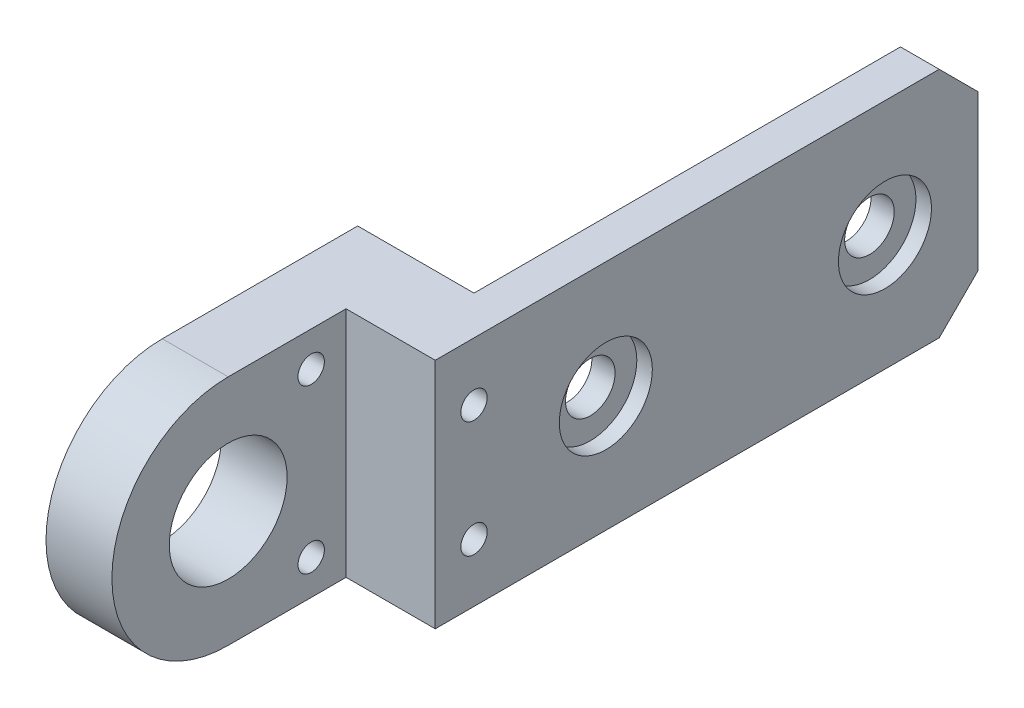
ISO-10303-21;
HEADER;
FILE_DESCRIPTION(('STEP AP214'),'2;1');
FILE_NAME('part.step','',(''),(''),'','','');
FILE_SCHEMA(('AUTOMOTIVE_DESIGN { 1 0 10303 214 1 1 1 1 }'));
ENDSEC;
DATA;
#1=APPLICATION_CONTEXT('core data for automotive mechanical design processes');
#2=APPLICATION_PROTOCOL_DEFINITION('international standard','automotive_design',2000,#1);
#3=PRODUCT_CONTEXT('',#1,'mechanical');
#4=PRODUCT('Part','Part','',(#3));
#5=PRODUCT_RELATED_PRODUCT_CATEGORY('part','',(#4));
#6=PRODUCT_DEFINITION_FORMATION('','',#4);
#7=PRODUCT_DEFINITION_CONTEXT('part definition',#1,'design');
#8=PRODUCT_DEFINITION('design','',#6,#7);
#9=PRODUCT_DEFINITION_SHAPE('','',#8);
#10=(LENGTH_UNIT() NAMED_UNIT(*) SI_UNIT(.MILLI.,.METRE.));
#11=(NAMED_UNIT(*) PLANE_ANGLE_UNIT() SI_UNIT($,.RADIAN.));
#12=(NAMED_UNIT(*) SI_UNIT($,.STERADIAN.) SOLID_ANGLE_UNIT());
#13=UNCERTAINTY_MEASURE_WITH_UNIT(LENGTH_MEASURE(1.E-05),#10,'distance_accuracy_value','');
#14=(GEOMETRIC_REPRESENTATION_CONTEXT(3) GLOBAL_UNCERTAINTY_ASSIGNED_CONTEXT((#13)) GLOBAL_UNIT_ASSIGNED_CONTEXT((#10,
#11,#12)) REPRESENTATION_CONTEXT('',''));
#15=CARTESIAN_POINT('',(0.,0.,0.));
#16=DIRECTION('',(0.,0.,1.));
#17=DIRECTION('',(1.,0.,0.));
#18=AXIS2_PLACEMENT_3D('',#15,#16,#17);
#19=CARTESIAN_POINT('',(18.,0.,0.));
#20=DIRECTION('',(1.,0.,0.));
#21=DIRECTION('',(0.,0.,-1.));
#22=AXIS2_PLACEMENT_3D('',#19,#20,#21);
#23=PLANE('',#22);
#24=CARTESIAN_POINT('',(18.,0.,-37.2));
#25=DIRECTION('',(1.,0.,0.));
#26=DIRECTION('',(0.,0.,-1.));
#27=AXIS2_PLACEMENT_3D('',#24,#25,#26);
#28=CIRCLE('',#27,3.2);
#29=CARTESIAN_POINT('',(18.,0.,-40.4));
#30=VERTEX_POINT('',#29);
#31=EDGE_CURVE('E665',#30,#30,#28,.T.);
#32=ORIENTED_EDGE('',*,*,#31,.F.);
#33=EDGE_LOOP('',(#32));
#34=FACE_BOUND('',#33,.T.);
#35=CARTESIAN_POINT('',(18.,0.,-37.2));
#36=DIRECTION('',(1.,0.,0.));
#37=DIRECTION('',(0.,0.,-1.));
#38=AXIS2_PLACEMENT_3D('',#35,#36,#37);
#39=CIRCLE('',#38,6.);
#40=CARTESIAN_POINT('',(18.,0.,-43.2));
#41=VERTEX_POINT('',#40);
#42=EDGE_CURVE('E740',#41,#41,#39,.T.);
#43=ORIENTED_EDGE('',*,*,#42,.T.);
#44=EDGE_LOOP('',(#43));
#45=FACE_BOUND('',#44,.T.);
#46=ADVANCED_FACE('F209',(#34,#45),#23,.T.);
#47=CARTESIAN_POINT('',(18.,0.,-73.2));
#48=DIRECTION('',(1.,0.,0.));
#49=DIRECTION('',(0.,0.,-1.));
#50=AXIS2_PLACEMENT_3D('',#47,#48,#49);
#51=CIRCLE('',#50,3.19999999999999);
#52=CARTESIAN_POINT('',(18.,0.,-76.4));
#53=VERTEX_POINT('',#52);
#54=EDGE_CURVE('E670',#53,#53,#51,.T.);
#55=ORIENTED_EDGE('',*,*,#54,.F.);
#56=EDGE_LOOP('',(#55));
#57=FACE_BOUND('',#56,.T.);
#58=CARTESIAN_POINT('',(18.,0.,-73.2));
#59=DIRECTION('',(1.,0.,0.));
#60=DIRECTION('',(0.,0.,-1.));
#61=AXIS2_PLACEMENT_3D('',#58,#59,#60);
#62=CIRCLE('',#61,6.00000000000001);
#63=CARTESIAN_POINT('',(18.,0.,-79.2));
#64=VERTEX_POINT('',#63);
#65=EDGE_CURVE('E761',#64,#64,#62,.T.);
#66=ORIENTED_EDGE('',*,*,#65,.T.);
#67=EDGE_LOOP('',(#66));
#68=FACE_BOUND('',#67,.T.);
#69=ADVANCED_FACE('F357',(#57,#68),#23,.T.);
#70=CARTESIAN_POINT('',(8.5,15.,0.));
#71=DIRECTION('',(0.,-1.,0.));
#72=DIRECTION('',(0.,0.,-1.));
#73=AXIS2_PLACEMENT_3D('',#70,#71,#72);
#74=PLANE('',#73);
#75=DIRECTION('',(0.,0.,1.));
#76=VECTOR('',#75,1.);
#77=CARTESIAN_POINT('',(8.5,15.,0.));
#78=LINE('',#77,#76);
#79=CARTESIAN_POINT('',(8.5,15.,-15.2));
#80=VERTEX_POINT('',#79);
#81=CARTESIAN_POINT('',(8.5,15.,0.));
#82=VERTEX_POINT('',#81);
#83=EDGE_CURVE('E305',#80,#82,#78,.T.);
#84=ORIENTED_EDGE('',*,*,#83,.F.);
#85=DIRECTION('',(-1.,0.,0.));
#86=VECTOR('',#85,1.);
#87=CARTESIAN_POINT('',(15.,15.,-15.2));
#88=LINE('',#87,#86);
#89=CARTESIAN_POINT('',(20.,15.,-15.2));
#90=VERTEX_POINT('',#89);
#91=EDGE_CURVE('E309',#90,#80,#88,.T.);
#92=ORIENTED_EDGE('',*,*,#91,.F.);
#93=DIRECTION('',(0.,0.,-1.));
#94=VECTOR('',#93,1.);
#95=CARTESIAN_POINT('',(20.,15.,0.));
#96=LINE('',#95,#94);
#97=CARTESIAN_POINT('',(20.,15.,-80.2));
#98=VERTEX_POINT('',#97);
#99=EDGE_CURVE('E703',#90,#98,#96,.T.);
#100=ORIENTED_EDGE('',*,*,#99,.T.);
#101=DIRECTION('',(-1.,0.,0.));
#102=VECTOR('',#101,1.);
#103=CARTESIAN_POINT('',(18.,15.,-80.2));
#104=LINE('',#103,#102);
#105=CARTESIAN_POINT('',(15.,15.,-80.2));
#106=VERTEX_POINT('',#105);
#107=EDGE_CURVE('E691',#98,#106,#104,.T.);
#108=ORIENTED_EDGE('',*,*,#107,.T.);
#109=DIRECTION('',(0.,0.,-1.));
#110=VECTOR('',#109,1.);
#111=CARTESIAN_POINT('',(15.,15.,0.));
#112=LINE('',#111,#110);
#113=CARTESIAN_POINT('',(15.,15.,-25.2));
#114=VERTEX_POINT('',#113);
#115=EDGE_CURVE('E274',#114,#106,#112,.T.);
#116=ORIENTED_EDGE('',*,*,#115,.F.);
#117=DIRECTION('',(-1.,0.,0.));
#118=VECTOR('',#117,1.);
#119=CARTESIAN_POINT('',(8.5,15.,-25.2));
#120=LINE('',#119,#118);
#121=CARTESIAN_POINT('',(0.,15.,-25.2));
#122=VERTEX_POINT('',#121);
#123=EDGE_CURVE('E255',#114,#122,#120,.T.);
#124=ORIENTED_EDGE('',*,*,#123,.T.);
#125=DIRECTION('',(0.,0.,1.));
#126=VECTOR('',#125,1.);
#127=CARTESIAN_POINT('',(0.,15.,0.));
#128=LINE('',#127,#126);
#129=CARTESIAN_POINT('',(0.,15.,0.));
#130=VERTEX_POINT('',#129);
#131=EDGE_CURVE('E270',#122,#130,#128,.T.);
#132=ORIENTED_EDGE('',*,*,#131,.T.);
#133=DIRECTION('',(-1.,0.,0.));
#134=VECTOR('',#133,1.);
#135=CARTESIAN_POINT('',(8.5,15.,0.));
#136=LINE('',#135,#134);
#137=EDGE_CURVE('E12',#82,#130,#136,.T.);
#138=ORIENTED_EDGE('',*,*,#137,.F.);
#139=EDGE_LOOP('',(#84,#92,#100,#108,#116,#124,#132,#138));
#140=FACE_BOUND('',#139,.T.);
#141=ADVANCED_FACE('F268',(#140),#74,.F.);
#142=CARTESIAN_POINT('',(8.5,0.,0.));
#143=DIRECTION('',(-1.,0.,0.));
#144=DIRECTION('',(0.,0.,1.));
#145=AXIS2_PLACEMENT_3D('',#142,#143,#144);
#146=CYLINDRICAL_SURFACE('',#145,15.);
#147=CARTESIAN_POINT('',(0.,0.,0.));
#148=DIRECTION('',(1.,0.,0.));
#149=DIRECTION('',(0.,0.,-1.));
#150=AXIS2_PLACEMENT_3D('',#147,#148,#149);
#151=CIRCLE('',#150,15.);
#152=CARTESIAN_POINT('',(0.,-15.,0.));
#153=VERTEX_POINT('',#152);
#154=EDGE_CURVE('E279',#130,#153,#151,.T.);
#155=ORIENTED_EDGE('',*,*,#154,.T.);
#156=DIRECTION('',(-1.,0.,0.));
#157=VECTOR('',#156,1.);
#158=CARTESIAN_POINT('',(8.5,-15.,0.));
#159=LINE('',#158,#157);
#160=CARTESIAN_POINT('',(8.5,-15.,0.));
#161=VERTEX_POINT('',#160);
#162=EDGE_CURVE('E217',#161,#153,#159,.T.);
#163=ORIENTED_EDGE('',*,*,#162,.F.);
#164=CARTESIAN_POINT('',(8.5,0.,0.));
#165=DIRECTION('',(1.,0.,0.));
#166=DIRECTION('',(0.,0.,-1.));
#167=AXIS2_PLACEMENT_3D('',#164,#165,#166);
#168=CIRCLE('',#167,15.);
#169=EDGE_CURVE('E230',#82,#161,#168,.T.);
#170=ORIENTED_EDGE('',*,*,#169,.F.);
#171=ORIENTED_EDGE('',*,*,#137,.T.);
#172=EDGE_LOOP('',(#155,#163,#170,#171));
#173=FACE_BOUND('',#172,.T.);
#174=ADVANCED_FACE('F303',(#173),#146,.T.);
#175=CARTESIAN_POINT('',(8.5,-15.,0.));
#176=DIRECTION('',(0.,1.,0.));
#177=DIRECTION('',(0.,0.,1.));
#178=AXIS2_PLACEMENT_3D('',#175,#176,#177);
#179=PLANE('',#178);
#180=DIRECTION('',(0.,0.,-1.));
#181=VECTOR('',#180,1.);
#182=CARTESIAN_POINT('',(0.,-15.,0.));
#183=LINE('',#182,#181);
#184=CARTESIAN_POINT('',(0.,-15.,-25.2));
#185=VERTEX_POINT('',#184);
#186=EDGE_CURVE('E263',#153,#185,#183,.T.);
#187=ORIENTED_EDGE('',*,*,#186,.T.);
#188=DIRECTION('',(-1.,0.,0.));
#189=VECTOR('',#188,1.);
#190=CARTESIAN_POINT('',(8.5,-15.,-25.2));
#191=LINE('',#190,#189);
#192=CARTESIAN_POINT('',(15.,-15.,-25.2));
#193=VERTEX_POINT('',#192);
#194=EDGE_CURVE('E258',#193,#185,#191,.T.);
#195=ORIENTED_EDGE('',*,*,#194,.F.);
#196=DIRECTION('',(0.,0.,1.));
#197=VECTOR('',#196,1.);
#198=CARTESIAN_POINT('',(15.,-15.,0.));
#199=LINE('',#198,#197);
#200=CARTESIAN_POINT('',(15.,-15.,-80.2));
#201=VERTEX_POINT('',#200);
#202=EDGE_CURVE('E672',#201,#193,#199,.T.);
#203=ORIENTED_EDGE('',*,*,#202,.F.);
#204=DIRECTION('',(-1.,0.,0.));
#205=VECTOR('',#204,1.);
#206=CARTESIAN_POINT('',(18.,-15.,-80.2));
#207=LINE('',#206,#205);
#208=CARTESIAN_POINT('',(20.,-15.,-80.2));
#209=VERTEX_POINT('',#208);
#210=EDGE_CURVE('E328',#209,#201,#207,.T.);
#211=ORIENTED_EDGE('',*,*,#210,.F.);
#212=DIRECTION('',(0.,0.,1.));
#213=VECTOR('',#212,1.);
#214=CARTESIAN_POINT('',(20.,-15.,0.));
#215=LINE('',#214,#213);
#216=CARTESIAN_POINT('',(20.,-15.,-15.2));
#217=VERTEX_POINT('',#216);
#218=EDGE_CURVE('E732',#209,#217,#215,.T.);
#219=ORIENTED_EDGE('',*,*,#218,.T.);
#220=DIRECTION('',(-1.,0.,0.));
#221=VECTOR('',#220,1.);
#222=CARTESIAN_POINT('',(15.,-15.,-15.2));
#223=LINE('',#222,#221);
#224=CARTESIAN_POINT('',(8.5,-15.,-15.2));
#225=VERTEX_POINT('',#224);
#226=EDGE_CURVE('E319',#217,#225,#223,.T.);
#227=ORIENTED_EDGE('',*,*,#226,.T.);
#228=DIRECTION('',(0.,0.,-1.));
#229=VECTOR('',#228,1.);
#230=CARTESIAN_POINT('',(8.5,-15.,0.));
#231=LINE('',#230,#229);
#232=EDGE_CURVE('E224',#161,#225,#231,.T.);
#233=ORIENTED_EDGE('',*,*,#232,.F.);
#234=ORIENTED_EDGE('',*,*,#162,.T.);
#235=EDGE_LOOP('',(#187,#195,#203,#211,#219,#227,#233,#234));
#236=FACE_BOUND('',#235,.T.);
#237=ADVANCED_FACE('F300',(#236),#179,.F.);
#238=CARTESIAN_POINT('',(8.5,-7.5,-20.2));
#239=DIRECTION('',(-1.,0.,0.));
#240=DIRECTION('',(0.,0.,1.));
#241=AXIS2_PLACEMENT_3D('',#238,#239,#240);
#242=CYLINDRICAL_SURFACE('',#241,1.7);
#243=CARTESIAN_POINT('',(0.,-7.5,-20.2));
#244=DIRECTION('',(1.,0.,0.));
#245=DIRECTION('',(0.,0.,-1.));
#246=AXIS2_PLACEMENT_3D('',#243,#244,#245);
#247=CIRCLE('',#246,1.7);
#248=CARTESIAN_POINT('',(0.,-7.5,-21.9));
#249=VERTEX_POINT('',#248);
#250=EDGE_CURVE('E291',#249,#249,#247,.T.);
#251=ORIENTED_EDGE('',*,*,#250,.F.);
#252=EDGE_LOOP('',(#251));
#253=FACE_BOUND('',#252,.T.);
#254=CARTESIAN_POINT('',(20.,-7.5,-20.2));
#255=DIRECTION('',(1.,0.,0.));
#256=DIRECTION('',(0.,0.,-1.));
#257=AXIS2_PLACEMENT_3D('',#254,#255,#256);
#258=CIRCLE('',#257,1.7);
#259=CARTESIAN_POINT('',(20.,-7.5,-21.9));
#260=VERTEX_POINT('',#259);
#261=EDGE_CURVE('E764',#260,#260,#258,.T.);
#262=ORIENTED_EDGE('',*,*,#261,.T.);
#263=EDGE_LOOP('',(#262));
#264=FACE_BOUND('',#263,.T.);
#265=ADVANCED_FACE('F392',(#253,#264),#242,.F.);
#266=CARTESIAN_POINT('',(8.5,0.,0.));
#267=DIRECTION('',(-1.,0.,0.));
#268=DIRECTION('',(0.,0.,1.));
#269=AXIS2_PLACEMENT_3D('',#266,#267,#268);
#270=CYLINDRICAL_SURFACE('',#269,7.6);
#271=CARTESIAN_POINT('',(8.5,0.,0.));
#272=DIRECTION('',(1.,0.,0.));
#273=DIRECTION('',(0.,0.,-1.));
#274=AXIS2_PLACEMENT_3D('',#271,#272,#273);
#275=CIRCLE('',#274,7.6);
#276=CARTESIAN_POINT('',(8.5,0.,-7.6));
#277=VERTEX_POINT('',#276);
#278=EDGE_CURVE('E275',#277,#277,#275,.T.);
#279=ORIENTED_EDGE('',*,*,#278,.T.);
#280=EDGE_LOOP('',(#279));
#281=FACE_BOUND('',#280,.T.);
#282=CARTESIAN_POINT('',(0.,0.,0.));
#283=DIRECTION('',(1.,0.,0.));
#284=DIRECTION('',(0.,0.,-1.));
#285=AXIS2_PLACEMENT_3D('',#282,#283,#284);
#286=CIRCLE('',#285,7.6);
#287=CARTESIAN_POINT('',(0.,0.,-7.6));
#288=VERTEX_POINT('',#287);
#289=EDGE_CURVE('E262',#288,#288,#286,.T.);
#290=ORIENTED_EDGE('',*,*,#289,.F.);
#291=EDGE_LOOP('',(#290));
#292=FACE_BOUND('',#291,.T.);
#293=ADVANCED_FACE('F395',(#281,#292),#270,.F.);
#294=CARTESIAN_POINT('',(8.5,0.,-25.2));
#295=DIRECTION('',(0.,0.,1.));
#296=DIRECTION('',(1.,0.,0.));
#297=AXIS2_PLACEMENT_3D('',#294,#295,#296);
#298=PLANE('',#297);
#299=DIRECTION('',(0.,1.,0.));
#300=VECTOR('',#299,1.);
#301=CARTESIAN_POINT('',(0.,0.,-25.2));
#302=LINE('',#301,#300);
#303=EDGE_CURVE('E250',#185,#122,#302,.T.);
#304=ORIENTED_EDGE('',*,*,#303,.T.);
#305=ORIENTED_EDGE('',*,*,#123,.F.);
#306=DIRECTION('',(0.,1.,0.));
#307=VECTOR('',#306,1.);
#308=CARTESIAN_POINT('',(15.,0.,-25.2));
#309=LINE('',#308,#307);
#310=EDGE_CURVE('E325',#193,#114,#309,.T.);
#311=ORIENTED_EDGE('',*,*,#310,.F.);
#312=ORIENTED_EDGE('',*,*,#194,.T.);
#313=EDGE_LOOP('',(#304,#305,#311,#312));
#314=FACE_BOUND('',#313,.T.);
#315=ADVANCED_FACE('F252',(#314),#298,.F.);
#316=CARTESIAN_POINT('',(8.5,-10.5,-10.7));
#317=DIRECTION('',(-1.,0.,0.));
#318=DIRECTION('',(0.,0.,1.));
#319=AXIS2_PLACEMENT_3D('',#316,#317,#318);
#320=CYLINDRICAL_SURFACE('',#319,1.7);
#321=CARTESIAN_POINT('',(8.5,-10.5,-10.7));
#322=DIRECTION('',(1.,0.,0.));
#323=DIRECTION('',(0.,0.,-1.));
#324=AXIS2_PLACEMENT_3D('',#321,#322,#323);
#325=CIRCLE('',#324,1.7);
#326=CARTESIAN_POINT('',(8.5,-10.5,-12.4));
#327=VERTEX_POINT('',#326);
#328=EDGE_CURVE('E312',#327,#327,#325,.T.);
#329=ORIENTED_EDGE('',*,*,#328,.T.);
#330=EDGE_LOOP('',(#329));
#331=FACE_BOUND('',#330,.T.);
#332=CARTESIAN_POINT('',(0.,-10.5,-10.7));
#333=DIRECTION('',(1.,0.,0.));
#334=DIRECTION('',(0.,0.,-1.));
#335=AXIS2_PLACEMENT_3D('',#332,#333,#334);
#336=CIRCLE('',#335,1.7);
#337=CARTESIAN_POINT('',(0.,-10.5,-12.4));
#338=VERTEX_POINT('',#337);
#339=EDGE_CURVE('E280',#338,#338,#336,.T.);
#340=ORIENTED_EDGE('',*,*,#339,.F.);
#341=EDGE_LOOP('',(#340));
#342=FACE_BOUND('',#341,.T.);
#343=ADVANCED_FACE('F346',(#331,#342),#320,.F.);
#344=CARTESIAN_POINT('',(8.5,10.5,-10.7));
#345=DIRECTION('',(-1.,0.,0.));
#346=DIRECTION('',(0.,0.,1.));
#347=AXIS2_PLACEMENT_3D('',#344,#345,#346);
#348=CYLINDRICAL_SURFACE('',#347,1.7);
#349=CARTESIAN_POINT('',(8.5,10.5,-10.7));
#350=DIRECTION('',(1.,0.,0.));
#351=DIRECTION('',(0.,0.,-1.));
#352=AXIS2_PLACEMENT_3D('',#349,#350,#351);
#353=CIRCLE('',#352,1.7);
#354=CARTESIAN_POINT('',(8.5,10.5,-12.4));
#355=VERTEX_POINT('',#354);
#356=EDGE_CURVE('E296',#355,#355,#353,.T.);
#357=ORIENTED_EDGE('',*,*,#356,.T.);
#358=EDGE_LOOP('',(#357));
#359=FACE_BOUND('',#358,.T.);
#360=CARTESIAN_POINT('',(0.,10.5,-10.7));
#361=DIRECTION('',(1.,0.,0.));
#362=DIRECTION('',(0.,0.,-1.));
#363=AXIS2_PLACEMENT_3D('',#360,#361,#362);
#364=CIRCLE('',#363,1.7);
#365=CARTESIAN_POINT('',(0.,10.5,-12.4));
#366=VERTEX_POINT('',#365);
#367=EDGE_CURVE('E284',#366,#366,#364,.T.);
#368=ORIENTED_EDGE('',*,*,#367,.F.);
#369=EDGE_LOOP('',(#368));
#370=FACE_BOUND('',#369,.T.);
#371=ADVANCED_FACE('F211',(#359,#370),#348,.F.);
#372=CARTESIAN_POINT('',(8.5,7.5,-20.2));
#373=DIRECTION('',(-1.,0.,0.));
#374=DIRECTION('',(0.,0.,1.));
#375=AXIS2_PLACEMENT_3D('',#372,#373,#374);
#376=CYLINDRICAL_SURFACE('',#375,1.7);
#377=CARTESIAN_POINT('',(0.,7.5,-20.2));
#378=DIRECTION('',(1.,0.,0.));
#379=DIRECTION('',(0.,0.,-1.));
#380=AXIS2_PLACEMENT_3D('',#377,#378,#379);
#381=CIRCLE('',#380,1.7);
#382=CARTESIAN_POINT('',(0.,7.5,-21.9));
#383=VERTEX_POINT('',#382);
#384=EDGE_CURVE('E294',#383,#383,#381,.T.);
#385=ORIENTED_EDGE('',*,*,#384,.F.);
#386=EDGE_LOOP('',(#385));
#387=FACE_BOUND('',#386,.T.);
#388=CARTESIAN_POINT('',(20.,7.5,-20.2));
#389=DIRECTION('',(1.,0.,0.));
#390=DIRECTION('',(0.,0.,-1.));
#391=AXIS2_PLACEMENT_3D('',#388,#389,#390);
#392=CIRCLE('',#391,1.7);
#393=CARTESIAN_POINT('',(20.,7.5,-21.9));
#394=VERTEX_POINT('',#393);
#395=EDGE_CURVE('E769',#394,#394,#392,.T.);
#396=ORIENTED_EDGE('',*,*,#395,.T.);
#397=EDGE_LOOP('',(#396));
#398=FACE_BOUND('',#397,.T.);
#399=ADVANCED_FACE('F345',(#387,#398),#376,.F.);
#400=CARTESIAN_POINT('',(8.5,0.,0.));
#401=DIRECTION('',(1.,0.,0.));
#402=DIRECTION('',(0.,0.,-1.));
#403=AXIS2_PLACEMENT_3D('',#400,#401,#402);
#404=PLANE('',#403);
#405=DIRECTION('',(0.,-1.,0.));
#406=VECTOR('',#405,1.);
#407=CARTESIAN_POINT('',(8.5,0.,-15.2));
#408=LINE('',#407,#406);
#409=EDGE_CURVE('E314',#80,#225,#408,.T.);
#410=ORIENTED_EDGE('',*,*,#409,.F.);
#411=ORIENTED_EDGE('',*,*,#83,.T.);
#412=ORIENTED_EDGE('',*,*,#169,.T.);
#413=ORIENTED_EDGE('',*,*,#232,.T.);
#414=EDGE_LOOP('',(#410,#411,#412,#413));
#415=FACE_BOUND('',#414,.T.);
#416=ORIENTED_EDGE('',*,*,#356,.F.);
#417=EDGE_LOOP('',(#416));
#418=FACE_BOUND('',#417,.T.);
#419=ORIENTED_EDGE('',*,*,#328,.F.);
#420=EDGE_LOOP('',(#419));
#421=FACE_BOUND('',#420,.T.);
#422=ORIENTED_EDGE('',*,*,#278,.F.);
#423=EDGE_LOOP('',(#422));
#424=FACE_BOUND('',#423,.T.);
#425=ADVANCED_FACE('F315',(#415,#418,#421,#424),#404,.T.);
#426=CARTESIAN_POINT('',(0.,0.,0.));
#427=DIRECTION('',(1.,0.,0.));
#428=DIRECTION('',(0.,0.,-1.));
#429=AXIS2_PLACEMENT_3D('',#426,#427,#428);
#430=PLANE('',#429);
#431=ORIENTED_EDGE('',*,*,#367,.T.);
#432=EDGE_LOOP('',(#431));
#433=FACE_BOUND('',#432,.T.);
#434=ORIENTED_EDGE('',*,*,#339,.T.);
#435=EDGE_LOOP('',(#434));
#436=FACE_BOUND('',#435,.T.);
#437=ORIENTED_EDGE('',*,*,#154,.F.);
#438=ORIENTED_EDGE('',*,*,#131,.F.);
#439=ORIENTED_EDGE('',*,*,#303,.F.);
#440=ORIENTED_EDGE('',*,*,#186,.F.);
#441=EDGE_LOOP('',(#437,#438,#439,#440));
#442=FACE_BOUND('',#441,.T.);
#443=ORIENTED_EDGE('',*,*,#289,.T.);
#444=EDGE_LOOP('',(#443));
#445=FACE_BOUND('',#444,.T.);
#446=ORIENTED_EDGE('',*,*,#384,.T.);
#447=EDGE_LOOP('',(#446));
#448=FACE_BOUND('',#447,.T.);
#449=ORIENTED_EDGE('',*,*,#250,.T.);
#450=EDGE_LOOP('',(#449));
#451=FACE_BOUND('',#450,.T.);
#452=ADVANCED_FACE('F277',(#433,#436,#442,#445,#448,#451),#430,.F.);
#453=CARTESIAN_POINT('',(15.,0.,-15.2));
#454=DIRECTION('',(0.,0.,1.));
#455=DIRECTION('',(1.,0.,0.));
#456=AXIS2_PLACEMENT_3D('',#453,#454,#455);
#457=PLANE('',#456);
#458=ORIENTED_EDGE('',*,*,#91,.T.);
#459=ORIENTED_EDGE('',*,*,#409,.T.);
#460=ORIENTED_EDGE('',*,*,#226,.F.);
#461=DIRECTION('',(0.,-1.,0.));
#462=VECTOR('',#461,1.);
#463=CARTESIAN_POINT('',(20.,0.,-15.2));
#464=LINE('',#463,#462);
#465=EDGE_CURVE('E323',#90,#217,#464,.T.);
#466=ORIENTED_EDGE('',*,*,#465,.F.);
#467=EDGE_LOOP('',(#458,#459,#460,#466));
#468=FACE_BOUND('',#467,.T.);
#469=ADVANCED_FACE('F321',(#468),#457,.T.);
#470=CARTESIAN_POINT('',(15.,0.,0.));
#471=DIRECTION('',(1.,0.,0.));
#472=DIRECTION('',(0.,0.,-1.));
#473=AXIS2_PLACEMENT_3D('',#470,#471,#472);
#474=PLANE('',#473);
#475=CARTESIAN_POINT('',(15.,0.,-73.2));
#476=DIRECTION('',(1.,0.,0.));
#477=DIRECTION('',(0.,0.,-1.));
#478=AXIS2_PLACEMENT_3D('',#475,#476,#477);
#479=CIRCLE('',#478,3.19999999999999);
#480=CARTESIAN_POINT('',(15.,0.,-76.4));
#481=VERTEX_POINT('',#480);
#482=EDGE_CURVE('E675',#481,#481,#479,.T.);
#483=ORIENTED_EDGE('',*,*,#482,.T.);
#484=EDGE_LOOP('',(#483));
#485=FACE_BOUND('',#484,.T.);
#486=CARTESIAN_POINT('',(15.,0.,-37.2));
#487=DIRECTION('',(1.,0.,0.));
#488=DIRECTION('',(0.,0.,-1.));
#489=AXIS2_PLACEMENT_3D('',#486,#487,#488);
#490=CIRCLE('',#489,3.2);
#491=CARTESIAN_POINT('',(15.,0.,-40.4));
#492=VERTEX_POINT('',#491);
#493=EDGE_CURVE('E668',#492,#492,#490,.T.);
#494=ORIENTED_EDGE('',*,*,#493,.T.);
#495=EDGE_LOOP('',(#494));
#496=FACE_BOUND('',#495,.T.);
#497=ORIENTED_EDGE('',*,*,#202,.T.);
#498=ORIENTED_EDGE('',*,*,#310,.T.);
#499=ORIENTED_EDGE('',*,*,#115,.T.);
#500=DIRECTION('',(0.,-0.707106781186546,-0.707106781186549));
#501=VECTOR('',#500,1.);
#502=CARTESIAN_POINT('',(15.,47.6,-47.5999999999999));
#503=LINE('',#502,#501);
#504=CARTESIAN_POINT('',(15.,9.99999999999999,-85.2));
#505=VERTEX_POINT('',#504);
#506=EDGE_CURVE('E682',#106,#505,#503,.T.);
#507=ORIENTED_EDGE('',*,*,#506,.T.);
#508=DIRECTION('',(0.,-1.,0.));
#509=VECTOR('',#508,1.);
#510=CARTESIAN_POINT('',(15.,0.,-85.2));
#511=LINE('',#510,#509);
#512=CARTESIAN_POINT('',(15.,-9.99999999999999,-85.2));
#513=VERTEX_POINT('',#512);
#514=EDGE_CURVE('E685',#505,#513,#511,.T.);
#515=ORIENTED_EDGE('',*,*,#514,.T.);
#516=DIRECTION('',(0.,-0.707106781186547,0.707106781186548));
#517=VECTOR('',#516,1.);
#518=CARTESIAN_POINT('',(15.,-47.6,-47.6));
#519=LINE('',#518,#517);
#520=EDGE_CURVE('E688',#513,#201,#519,.T.);
#521=ORIENTED_EDGE('',*,*,#520,.T.);
#522=EDGE_LOOP('',(#497,#498,#499,#507,#515,#521));
#523=FACE_BOUND('',#522,.T.);
#524=ADVANCED_FACE('F371',(#485,#496,#523),#474,.F.);
#525=CARTESIAN_POINT('',(18.,-47.6,-47.6));
#526=DIRECTION('',(0.,-0.707106781186548,-0.707106781186547));
#527=DIRECTION('',(0.,0.707106781186547,-0.707106781186548));
#528=AXIS2_PLACEMENT_3D('',#525,#526,#527);
#529=PLANE('',#528);
#530=ORIENTED_EDGE('',*,*,#520,.F.);
#531=DIRECTION('',(-1.,0.,0.));
#532=VECTOR('',#531,1.);
#533=CARTESIAN_POINT('',(18.,-9.99999999999999,-85.2));
#534=LINE('',#533,#532);
#535=CARTESIAN_POINT('',(20.,-9.99999999999999,-85.2));
#536=VERTEX_POINT('',#535);
#537=EDGE_CURVE('E694',#536,#513,#534,.T.);
#538=ORIENTED_EDGE('',*,*,#537,.F.);
#539=DIRECTION('',(0.,-0.707106781186547,0.707106781186548));
#540=VECTOR('',#539,1.);
#541=CARTESIAN_POINT('',(20.,-47.6,-47.6));
#542=LINE('',#541,#540);
#543=EDGE_CURVE('E728',#536,#209,#542,.T.);
#544=ORIENTED_EDGE('',*,*,#543,.T.);
#545=ORIENTED_EDGE('',*,*,#210,.T.);
#546=EDGE_LOOP('',(#530,#538,#544,#545));
#547=FACE_BOUND('',#546,.T.);
#548=ADVANCED_FACE('F374',(#547),#529,.T.);
#549=CARTESIAN_POINT('',(18.,0.,-85.2));
#550=DIRECTION('',(0.,0.,-1.));
#551=DIRECTION('',(-1.,0.,0.));
#552=AXIS2_PLACEMENT_3D('',#549,#550,#551);
#553=PLANE('',#552);
#554=ORIENTED_EDGE('',*,*,#514,.F.);
#555=DIRECTION('',(-1.,0.,0.));
#556=VECTOR('',#555,1.);
#557=CARTESIAN_POINT('',(18.,9.99999999999999,-85.2));
#558=LINE('',#557,#556);
#559=CARTESIAN_POINT('',(20.,10.,-85.2));
#560=VERTEX_POINT('',#559);
#561=EDGE_CURVE('E697',#560,#505,#558,.T.);
#562=ORIENTED_EDGE('',*,*,#561,.F.);
#563=DIRECTION('',(0.,-1.,0.));
#564=VECTOR('',#563,1.);
#565=CARTESIAN_POINT('',(20.,0.,-85.2));
#566=LINE('',#565,#564);
#567=EDGE_CURVE('E747',#560,#536,#566,.T.);
#568=ORIENTED_EDGE('',*,*,#567,.T.);
#569=ORIENTED_EDGE('',*,*,#537,.T.);
#570=EDGE_LOOP('',(#554,#562,#568,#569));
#571=FACE_BOUND('',#570,.T.);
#572=ADVANCED_FACE('F378',(#571),#553,.T.);
#573=CARTESIAN_POINT('',(18.,47.6,-47.5999999999999));
#574=DIRECTION('',(0.,0.707106781186548,-0.707106781186546));
#575=DIRECTION('',(0.,0.707106781186546,0.707106781186549));
#576=AXIS2_PLACEMENT_3D('',#573,#574,#575);
#577=PLANE('',#576);
#578=ORIENTED_EDGE('',*,*,#506,.F.);
#579=ORIENTED_EDGE('',*,*,#107,.F.);
#580=DIRECTION('',(0.,-0.707106781186546,-0.707106781186549));
#581=VECTOR('',#580,1.);
#582=CARTESIAN_POINT('',(20.,47.6,-47.5999999999999));
#583=LINE('',#582,#581);
#584=EDGE_CURVE('E745',#98,#560,#583,.T.);
#585=ORIENTED_EDGE('',*,*,#584,.T.);
#586=ORIENTED_EDGE('',*,*,#561,.T.);
#587=EDGE_LOOP('',(#578,#579,#585,#586));
#588=FACE_BOUND('',#587,.T.);
#589=ADVANCED_FACE('F382',(#588),#577,.T.);
#590=CARTESIAN_POINT('',(18.,0.,-37.2));
#591=DIRECTION('',(-1.,0.,0.));
#592=DIRECTION('',(0.,0.,1.));
#593=AXIS2_PLACEMENT_3D('',#590,#591,#592);
#594=CYLINDRICAL_SURFACE('',#593,3.2);
#595=ORIENTED_EDGE('',*,*,#31,.T.);
#596=EDGE_LOOP('',(#595));
#597=FACE_BOUND('',#596,.T.);
#598=ORIENTED_EDGE('',*,*,#493,.F.);
#599=EDGE_LOOP('',(#598));
#600=FACE_BOUND('',#599,.T.);
#601=ADVANCED_FACE('F369',(#597,#600),#594,.F.);
#602=CARTESIAN_POINT('',(18.,0.,-73.2));
#603=DIRECTION('',(-1.,0.,0.));
#604=DIRECTION('',(0.,0.,1.));
#605=AXIS2_PLACEMENT_3D('',#602,#603,#604);
#606=CYLINDRICAL_SURFACE('',#605,3.19999999999999);
#607=ORIENTED_EDGE('',*,*,#54,.T.);
#608=EDGE_LOOP('',(#607));
#609=FACE_BOUND('',#608,.T.);
#610=ORIENTED_EDGE('',*,*,#482,.F.);
#611=EDGE_LOOP('',(#610));
#612=FACE_BOUND('',#611,.T.);
#613=ADVANCED_FACE('F457',(#609,#612),#606,.F.);
#614=CARTESIAN_POINT('',(20.,0.,0.));
#615=DIRECTION('',(1.,0.,0.));
#616=DIRECTION('',(0.,0.,-1.));
#617=AXIS2_PLACEMENT_3D('',#614,#615,#616);
#618=PLANE('',#617);
#619=ORIENTED_EDGE('',*,*,#261,.F.);
#620=EDGE_LOOP('',(#619));
#621=FACE_BOUND('',#620,.T.);
#622=CARTESIAN_POINT('',(20.,0.,-37.2));
#623=DIRECTION('',(1.,0.,0.));
#624=DIRECTION('',(0.,0.,-1.));
#625=AXIS2_PLACEMENT_3D('',#622,#623,#624);
#626=CIRCLE('',#625,6.);
#627=CARTESIAN_POINT('',(20.,0.,-43.2));
#628=VERTEX_POINT('',#627);
#629=EDGE_CURVE('E736',#628,#628,#626,.T.);
#630=ORIENTED_EDGE('',*,*,#629,.F.);
#631=EDGE_LOOP('',(#630));
#632=FACE_BOUND('',#631,.T.);
#633=ORIENTED_EDGE('',*,*,#218,.F.);
#634=ORIENTED_EDGE('',*,*,#543,.F.);
#635=ORIENTED_EDGE('',*,*,#567,.F.);
#636=ORIENTED_EDGE('',*,*,#584,.F.);
#637=ORIENTED_EDGE('',*,*,#99,.F.);
#638=ORIENTED_EDGE('',*,*,#465,.T.);
#639=EDGE_LOOP('',(#633,#634,#635,#636,#637,#638));
#640=FACE_BOUND('',#639,.T.);
#641=CARTESIAN_POINT('',(20.,0.,-73.2));
#642=DIRECTION('',(1.,0.,0.));
#643=DIRECTION('',(0.,0.,-1.));
#644=AXIS2_PLACEMENT_3D('',#641,#642,#643);
#645=CIRCLE('',#644,6.00000000000001);
#646=CARTESIAN_POINT('',(20.,0.,-79.2));
#647=VERTEX_POINT('',#646);
#648=EDGE_CURVE('E759',#647,#647,#645,.T.);
#649=ORIENTED_EDGE('',*,*,#648,.F.);
#650=EDGE_LOOP('',(#649));
#651=FACE_BOUND('',#650,.T.);
#652=ORIENTED_EDGE('',*,*,#395,.F.);
#653=EDGE_LOOP('',(#652));
#654=FACE_BOUND('',#653,.T.);
#655=ADVANCED_FACE('F452',(#621,#632,#640,#651,#654),#618,.T.);
#656=CARTESIAN_POINT('',(20.,0.,-37.2));
#657=DIRECTION('',(-1.,0.,0.));
#658=DIRECTION('',(0.,0.,1.));
#659=AXIS2_PLACEMENT_3D('',#656,#657,#658);
#660=CYLINDRICAL_SURFACE('',#659,6.);
#661=ORIENTED_EDGE('',*,*,#629,.T.);
#662=EDGE_LOOP('',(#661));
#663=FACE_BOUND('',#662,.T.);
#664=ORIENTED_EDGE('',*,*,#42,.F.);
#665=EDGE_LOOP('',(#664));
#666=FACE_BOUND('',#665,.T.);
#667=ADVANCED_FACE('F456',(#663,#666),#660,.F.);
#668=CARTESIAN_POINT('',(20.,0.,-73.2));
#669=DIRECTION('',(-1.,0.,0.));
#670=DIRECTION('',(0.,0.,1.));
#671=AXIS2_PLACEMENT_3D('',#668,#669,#670);
#672=CYLINDRICAL_SURFACE('',#671,6.00000000000001);
#673=ORIENTED_EDGE('',*,*,#648,.T.);
#674=EDGE_LOOP('',(#673));
#675=FACE_BOUND('',#674,.T.);
#676=ORIENTED_EDGE('',*,*,#65,.F.);
#677=EDGE_LOOP('',(#676));
#678=FACE_BOUND('',#677,.T.);
#679=ADVANCED_FACE('F465',(#675,#678),#672,.F.);
#680=CLOSED_SHELL('',(#46,#69,#141,#174,#237,#265,#293,#315,#343,#371,#399,#425,#452,#469,#524,
#548,#572,#589,#601,#613,#655,#667,#679));
#681=MANIFOLD_SOLID_BREP('B2',#680);
#682=ADVANCED_BREP_SHAPE_REPRESENTATION('',(#18,#681),#14);
#683=SHAPE_DEFINITION_REPRESENTATION(#9,#682);
ENDSEC;
END-ISO-10303-21;
